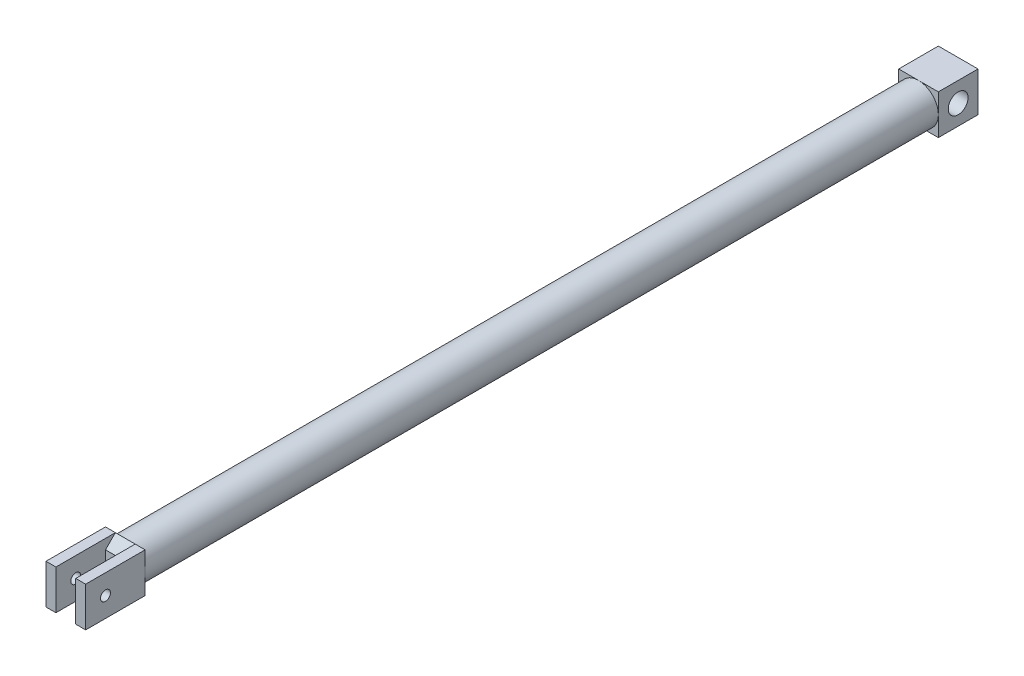
ISO-10303-21;
HEADER;
FILE_DESCRIPTION(('STEP AP214'),'2;1');
FILE_NAME('part.step','',(''),(''),'','','');
FILE_SCHEMA(('AUTOMOTIVE_DESIGN { 1 0 10303 214 1 1 1 1 }'));
ENDSEC;
DATA;
#1=APPLICATION_CONTEXT('core data for automotive mechanical design processes');
#2=APPLICATION_PROTOCOL_DEFINITION('international standard','automotive_design',2000,#1);
#3=PRODUCT_CONTEXT('',#1,'mechanical');
#4=PRODUCT('Part','Part','',(#3));
#5=PRODUCT_RELATED_PRODUCT_CATEGORY('part','',(#4));
#6=PRODUCT_DEFINITION_FORMATION('','',#4);
#7=PRODUCT_DEFINITION_CONTEXT('part definition',#1,'design');
#8=PRODUCT_DEFINITION('design','',#6,#7);
#9=PRODUCT_DEFINITION_SHAPE('','',#8);
#10=(LENGTH_UNIT() NAMED_UNIT(*) SI_UNIT(.MILLI.,.METRE.));
#11=(NAMED_UNIT(*) PLANE_ANGLE_UNIT() SI_UNIT($,.RADIAN.));
#12=(NAMED_UNIT(*) SI_UNIT($,.STERADIAN.) SOLID_ANGLE_UNIT());
#13=UNCERTAINTY_MEASURE_WITH_UNIT(LENGTH_MEASURE(1.E-05),#10,'distance_accuracy_value','');
#14=(GEOMETRIC_REPRESENTATION_CONTEXT(3) GLOBAL_UNCERTAINTY_ASSIGNED_CONTEXT((#13)) GLOBAL_UNIT_ASSIGNED_CONTEXT((#10,
#11,#12)) REPRESENTATION_CONTEXT('',''));
#15=CARTESIAN_POINT('',(0.,0.,0.));
#16=DIRECTION('',(0.,0.,1.));
#17=DIRECTION('',(1.,0.,0.));
#18=AXIS2_PLACEMENT_3D('',#15,#16,#17);
#19=CARTESIAN_POINT('',(-10.,10.,430.));
#20=DIRECTION('',(0.,-1.,0.));
#21=DIRECTION('',(0.,0.,-1.));
#22=AXIS2_PLACEMENT_3D('',#19,#20,#21);
#23=PLANE('',#22);
#24=DIRECTION('',(0.,0.,1.));
#25=VECTOR('',#24,1.);
#26=CARTESIAN_POINT('',(-5.,10.,405.));
#27=LINE('',#26,#25);
#28=CARTESIAN_POINT('',(-5.,10.,400.));
#29=VERTEX_POINT('',#28);
#30=CARTESIAN_POINT('',(-5.,10.,430.));
#31=VERTEX_POINT('',#30);
#32=EDGE_CURVE('E56',#29,#31,#27,.T.);
#33=ORIENTED_EDGE('',*,*,#32,.F.);
#34=DIRECTION('',(-1.,0.,0.));
#35=VECTOR('',#34,1.);
#36=CARTESIAN_POINT('',(-10.,10.,400.));
#37=LINE('',#36,#35);
#38=CARTESIAN_POINT('',(-10.,10.,400.));
#39=VERTEX_POINT('',#38);
#40=EDGE_CURVE('E209',#29,#39,#37,.T.);
#41=ORIENTED_EDGE('',*,*,#40,.T.);
#42=DIRECTION('',(0.,0.,-1.));
#43=VECTOR('',#42,1.);
#44=CARTESIAN_POINT('',(-10.,10.,430.));
#45=LINE('',#44,#43);
#46=CARTESIAN_POINT('',(-10.,10.,430.));
#47=VERTEX_POINT('',#46);
#48=EDGE_CURVE('E234',#47,#39,#45,.T.);
#49=ORIENTED_EDGE('',*,*,#48,.F.);
#50=DIRECTION('',(-1.,0.,0.));
#51=VECTOR('',#50,1.);
#52=CARTESIAN_POINT('',(-10.,10.,430.));
#53=LINE('',#52,#51);
#54=EDGE_CURVE('E192',#31,#47,#53,.T.);
#55=ORIENTED_EDGE('',*,*,#54,.F.);
#56=EDGE_LOOP('',(#33,#41,#49,#55));
#57=FACE_BOUND('',#56,.T.);
#58=ADVANCED_FACE('F39',(#57),#23,.F.);
#59=CARTESIAN_POINT('',(-10.,-10.,430.));
#60=DIRECTION('',(0.,1.,0.));
#61=DIRECTION('',(0.,0.,1.));
#62=AXIS2_PLACEMENT_3D('',#59,#60,#61);
#63=PLANE('',#62);
#64=DIRECTION('',(0.,0.,1.));
#65=VECTOR('',#64,1.);
#66=CARTESIAN_POINT('',(5.,-10.,405.));
#67=LINE('',#66,#65);
#68=CARTESIAN_POINT('',(5.,-10.,400.));
#69=VERTEX_POINT('',#68);
#70=CARTESIAN_POINT('',(5.,-10.,430.));
#71=VERTEX_POINT('',#70);
#72=EDGE_CURVE('E166',#69,#71,#67,.T.);
#73=ORIENTED_EDGE('',*,*,#72,.F.);
#74=DIRECTION('',(1.,0.,0.));
#75=VECTOR('',#74,1.);
#76=CARTESIAN_POINT('',(-10.,-10.,400.));
#77=LINE('',#76,#75);
#78=CARTESIAN_POINT('',(10.,-10.,400.));
#79=VERTEX_POINT('',#78);
#80=EDGE_CURVE('E220',#69,#79,#77,.T.);
#81=ORIENTED_EDGE('',*,*,#80,.T.);
#82=DIRECTION('',(0.,0.,-1.));
#83=VECTOR('',#82,1.);
#84=CARTESIAN_POINT('',(10.,-10.,430.));
#85=LINE('',#84,#83);
#86=CARTESIAN_POINT('',(10.,-10.,430.));
#87=VERTEX_POINT('',#86);
#88=EDGE_CURVE('E204',#87,#79,#85,.T.);
#89=ORIENTED_EDGE('',*,*,#88,.F.);
#90=DIRECTION('',(1.,0.,0.));
#91=VECTOR('',#90,1.);
#92=CARTESIAN_POINT('',(-10.,-10.,430.));
#93=LINE('',#92,#91);
#94=EDGE_CURVE('E196',#71,#87,#93,.T.);
#95=ORIENTED_EDGE('',*,*,#94,.F.);
#96=EDGE_LOOP('',(#73,#81,#89,#95));
#97=FACE_BOUND('',#96,.T.);
#98=ADVANCED_FACE('F420',(#97),#63,.F.);
#99=CARTESIAN_POINT('',(0.,0.,430.));
#100=DIRECTION('',(0.,0.,1.));
#101=DIRECTION('',(1.,0.,0.));
#102=AXIS2_PLACEMENT_3D('',#99,#100,#101);
#103=PLANE('',#102);
#104=DIRECTION('',(0.,1.,0.));
#105=VECTOR('',#104,1.);
#106=CARTESIAN_POINT('',(5.,10.,430.));
#107=LINE('',#106,#105);
#108=CARTESIAN_POINT('',(5.,10.,430.));
#109=VERTEX_POINT('',#108);
#110=EDGE_CURVE('E163',#71,#109,#107,.T.);
#111=ORIENTED_EDGE('',*,*,#110,.F.);
#112=ORIENTED_EDGE('',*,*,#94,.T.);
#113=DIRECTION('',(0.,1.,0.));
#114=VECTOR('',#113,1.);
#115=CARTESIAN_POINT('',(10.,10.,430.));
#116=LINE('',#115,#114);
#117=CARTESIAN_POINT('',(10.,10.,430.));
#118=VERTEX_POINT('',#117);
#119=EDGE_CURVE('E188',#87,#118,#116,.T.);
#120=ORIENTED_EDGE('',*,*,#119,.T.);
#121=EDGE_CURVE('E178',#118,#109,#53,.T.);
#122=ORIENTED_EDGE('',*,*,#121,.T.);
#123=EDGE_LOOP('',(#111,#112,#120,#122));
#124=FACE_BOUND('',#123,.T.);
#125=ADVANCED_FACE('F186',(#124),#103,.T.);
#126=CARTESIAN_POINT('',(0.,0.,400.));
#127=DIRECTION('',(0.,0.,-1.));
#128=DIRECTION('',(-1.,0.,0.));
#129=AXIS2_PLACEMENT_3D('',#126,#127,#128);
#130=CYLINDRICAL_SURFACE('',#129,10.);
#131=CARTESIAN_POINT('',(0.,0.,400.));
#132=DIRECTION('',(0.,0.,1.));
#133=DIRECTION('',(1.,0.,0.));
#134=AXIS2_PLACEMENT_3D('',#131,#132,#133);
#135=CIRCLE('',#134,10.);
#136=CARTESIAN_POINT('',(10.,0.,400.));
#137=VERTEX_POINT('',#136);
#138=CARTESIAN_POINT('',(0.,9.99999999999999,400.));
#139=VERTEX_POINT('',#138);
#140=EDGE_CURVE('E298',#137,#139,#135,.T.);
#141=ORIENTED_EDGE('',*,*,#140,.F.);
#142=CARTESIAN_POINT('',(0.,-9.99999999999999,400.));
#143=VERTEX_POINT('',#142);
#144=EDGE_CURVE('E304',#143,#137,#135,.T.);
#145=ORIENTED_EDGE('',*,*,#144,.F.);
#146=CARTESIAN_POINT('',(-10.,0.,400.));
#147=VERTEX_POINT('',#146);
#148=EDGE_CURVE('E361',#147,#143,#135,.T.);
#149=ORIENTED_EDGE('',*,*,#148,.F.);
#150=EDGE_CURVE('E303',#139,#147,#135,.T.);
#151=ORIENTED_EDGE('',*,*,#150,.F.);
#152=EDGE_LOOP('',(#141,#145,#149,#151));
#153=FACE_BOUND('',#152,.T.);
#154=CARTESIAN_POINT('',(0.,0.,0.));
#155=DIRECTION('',(0.,0.,1.));
#156=DIRECTION('',(1.,0.,0.));
#157=AXIS2_PLACEMENT_3D('',#154,#155,#156);
#158=CIRCLE('',#157,10.);
#159=CARTESIAN_POINT('',(10.,0.,0.));
#160=VERTEX_POINT('',#159);
#161=CARTESIAN_POINT('',(0.,10.,0.));
#162=VERTEX_POINT('',#161);
#163=EDGE_CURVE('E305',#160,#162,#158,.T.);
#164=ORIENTED_EDGE('',*,*,#163,.T.);
#165=CARTESIAN_POINT('',(-10.,0.,0.));
#166=VERTEX_POINT('',#165);
#167=EDGE_CURVE('E309',#162,#166,#158,.T.);
#168=ORIENTED_EDGE('',*,*,#167,.T.);
#169=CARTESIAN_POINT('',(0.,-10.,0.));
#170=VERTEX_POINT('',#169);
#171=EDGE_CURVE('E508',#166,#170,#158,.T.);
#172=ORIENTED_EDGE('',*,*,#171,.T.);
#173=EDGE_CURVE('E297',#170,#160,#158,.T.);
#174=ORIENTED_EDGE('',*,*,#173,.T.);
#175=EDGE_LOOP('',(#164,#168,#172,#174));
#176=FACE_BOUND('',#175,.T.);
#177=ADVANCED_FACE('F464',(#153,#176),#130,.T.);
#178=CARTESIAN_POINT('',(0.,0.,0.));
#179=DIRECTION('',(0.,0.,-1.));
#180=DIRECTION('',(-1.,0.,0.));
#181=AXIS2_PLACEMENT_3D('',#178,#179,#180);
#182=PLANE('',#181);
#183=ORIENTED_EDGE('',*,*,#163,.F.);
#184=DIRECTION('',(0.,-1.,0.));
#185=VECTOR('',#184,1.);
#186=CARTESIAN_POINT('',(10.,10.,0.));
#187=LINE('',#186,#185);
#188=CARTESIAN_POINT('',(10.,10.,0.));
#189=VERTEX_POINT('',#188);
#190=EDGE_CURVE('E275',#189,#160,#187,.T.);
#191=ORIENTED_EDGE('',*,*,#190,.F.);
#192=DIRECTION('',(1.,0.,0.));
#193=VECTOR('',#192,1.);
#194=CARTESIAN_POINT('',(10.,10.,0.));
#195=LINE('',#194,#193);
#196=EDGE_CURVE('E269',#162,#189,#195,.T.);
#197=ORIENTED_EDGE('',*,*,#196,.F.);
#198=EDGE_LOOP('',(#183,#191,#197));
#199=FACE_BOUND('',#198,.T.);
#200=ADVANCED_FACE('F447',(#199),#182,.F.);
#201=ORIENTED_EDGE('',*,*,#167,.F.);
#202=CARTESIAN_POINT('',(-9.99999999999999,10.,0.));
#203=VERTEX_POINT('',#202);
#204=EDGE_CURVE('E270',#203,#162,#195,.T.);
#205=ORIENTED_EDGE('',*,*,#204,.F.);
#206=DIRECTION('',(0.,1.,0.));
#207=VECTOR('',#206,1.);
#208=CARTESIAN_POINT('',(-9.99999999999999,10.,0.));
#209=LINE('',#208,#207);
#210=EDGE_CURVE('E249',#166,#203,#209,.T.);
#211=ORIENTED_EDGE('',*,*,#210,.F.);
#212=EDGE_LOOP('',(#201,#205,#211));
#213=FACE_BOUND('',#212,.T.);
#214=ADVANCED_FACE('F524',(#213),#182,.F.);
#215=ORIENTED_EDGE('',*,*,#171,.F.);
#216=CARTESIAN_POINT('',(-10.,-10.,0.));
#217=VERTEX_POINT('',#216);
#218=EDGE_CURVE('E265',#217,#166,#209,.T.);
#219=ORIENTED_EDGE('',*,*,#218,.F.);
#220=DIRECTION('',(-1.,0.,0.));
#221=VECTOR('',#220,1.);
#222=CARTESIAN_POINT('',(10.,-10.,0.));
#223=LINE('',#222,#221);
#224=EDGE_CURVE('E278',#170,#217,#223,.T.);
#225=ORIENTED_EDGE('',*,*,#224,.F.);
#226=EDGE_LOOP('',(#215,#219,#225));
#227=FACE_BOUND('',#226,.T.);
#228=ADVANCED_FACE('F448',(#227),#182,.F.);
#229=CARTESIAN_POINT('',(-9.99999999999999,10.,-20.));
#230=DIRECTION('',(1.,0.,0.));
#231=DIRECTION('',(0.,1.,0.));
#232=AXIS2_PLACEMENT_3D('',#229,#230,#231);
#233=PLANE('',#232);
#234=CARTESIAN_POINT('',(-10.,0.,-10.));
#235=DIRECTION('',(1.,0.,0.));
#236=DIRECTION('',(0.,1.,0.));
#237=AXIS2_PLACEMENT_3D('',#234,#235,#236);
#238=CIRCLE('',#237,5.);
#239=CARTESIAN_POINT('',(-10.,5.,-10.));
#240=VERTEX_POINT('',#239);
#241=EDGE_CURVE('E245',#240,#240,#238,.T.);
#242=ORIENTED_EDGE('',*,*,#241,.T.);
#243=EDGE_LOOP('',(#242));
#244=FACE_BOUND('',#243,.T.);
#245=ORIENTED_EDGE('',*,*,#218,.T.);
#246=ORIENTED_EDGE('',*,*,#210,.T.);
#247=DIRECTION('',(0.,0.,1.));
#248=VECTOR('',#247,1.);
#249=CARTESIAN_POINT('',(-9.99999999999999,10.,-20.));
#250=LINE('',#249,#248);
#251=CARTESIAN_POINT('',(-9.99999999999999,10.,-20.));
#252=VERTEX_POINT('',#251);
#253=EDGE_CURVE('E293',#252,#203,#250,.T.);
#254=ORIENTED_EDGE('',*,*,#253,.F.);
#255=DIRECTION('',(0.,1.,0.));
#256=VECTOR('',#255,1.);
#257=CARTESIAN_POINT('',(-9.99999999999999,10.,-20.));
#258=LINE('',#257,#256);
#259=CARTESIAN_POINT('',(-10.,-10.,-20.));
#260=VERTEX_POINT('',#259);
#261=EDGE_CURVE('E250',#260,#252,#258,.T.);
#262=ORIENTED_EDGE('',*,*,#261,.F.);
#263=DIRECTION('',(0.,0.,1.));
#264=VECTOR('',#263,1.);
#265=CARTESIAN_POINT('',(-10.,-10.,-20.));
#266=LINE('',#265,#264);
#267=EDGE_CURVE('E264',#260,#217,#266,.T.);
#268=ORIENTED_EDGE('',*,*,#267,.T.);
#269=EDGE_LOOP('',(#245,#246,#254,#262,#268));
#270=FACE_BOUND('',#269,.T.);
#271=ADVANCED_FACE('F459',(#244,#270),#233,.F.);
#272=CARTESIAN_POINT('',(10.,10.,-20.));
#273=DIRECTION('',(0.,-1.,0.));
#274=DIRECTION('',(0.,0.,-1.));
#275=AXIS2_PLACEMENT_3D('',#272,#273,#274);
#276=PLANE('',#275);
#277=ORIENTED_EDGE('',*,*,#204,.T.);
#278=ORIENTED_EDGE('',*,*,#196,.T.);
#279=DIRECTION('',(0.,0.,1.));
#280=VECTOR('',#279,1.);
#281=CARTESIAN_POINT('',(10.,10.,-20.));
#282=LINE('',#281,#280);
#283=CARTESIAN_POINT('',(10.,10.,-20.));
#284=VERTEX_POINT('',#283);
#285=EDGE_CURVE('E289',#284,#189,#282,.T.);
#286=ORIENTED_EDGE('',*,*,#285,.F.);
#287=DIRECTION('',(1.,0.,0.));
#288=VECTOR('',#287,1.);
#289=CARTESIAN_POINT('',(10.,10.,-20.));
#290=LINE('',#289,#288);
#291=EDGE_CURVE('E254',#252,#284,#290,.T.);
#292=ORIENTED_EDGE('',*,*,#291,.F.);
#293=ORIENTED_EDGE('',*,*,#253,.T.);
#294=EDGE_LOOP('',(#277,#278,#286,#292,#293));
#295=FACE_BOUND('',#294,.T.);
#296=ADVANCED_FACE('F455',(#295),#276,.F.);
#297=CARTESIAN_POINT('',(10.,10.,-20.));
#298=DIRECTION('',(-1.,0.,0.));
#299=DIRECTION('',(0.,-1.,0.));
#300=AXIS2_PLACEMENT_3D('',#297,#298,#299);
#301=PLANE('',#300);
#302=CARTESIAN_POINT('',(10.,0.,-10.));
#303=DIRECTION('',(1.,0.,0.));
#304=DIRECTION('',(0.,1.,0.));
#305=AXIS2_PLACEMENT_3D('',#302,#303,#304);
#306=CIRCLE('',#305,5.);
#307=CARTESIAN_POINT('',(10.,5.,-10.));
#308=VERTEX_POINT('',#307);
#309=EDGE_CURVE('E241',#308,#308,#306,.T.);
#310=ORIENTED_EDGE('',*,*,#309,.F.);
#311=EDGE_LOOP('',(#310));
#312=FACE_BOUND('',#311,.T.);
#313=ORIENTED_EDGE('',*,*,#190,.T.);
#314=CARTESIAN_POINT('',(10.,-10.,0.));
#315=VERTEX_POINT('',#314);
#316=EDGE_CURVE('E274',#160,#315,#187,.T.);
#317=ORIENTED_EDGE('',*,*,#316,.T.);
#318=DIRECTION('',(0.,0.,1.));
#319=VECTOR('',#318,1.);
#320=CARTESIAN_POINT('',(10.,-10.,-20.));
#321=LINE('',#320,#319);
#322=CARTESIAN_POINT('',(10.,-10.,-20.));
#323=VERTEX_POINT('',#322);
#324=EDGE_CURVE('E285',#323,#315,#321,.T.);
#325=ORIENTED_EDGE('',*,*,#324,.F.);
#326=DIRECTION('',(0.,-1.,0.));
#327=VECTOR('',#326,1.);
#328=CARTESIAN_POINT('',(10.,10.,-20.));
#329=LINE('',#328,#327);
#330=EDGE_CURVE('E258',#284,#323,#329,.T.);
#331=ORIENTED_EDGE('',*,*,#330,.F.);
#332=ORIENTED_EDGE('',*,*,#285,.T.);
#333=EDGE_LOOP('',(#313,#317,#325,#331,#332));
#334=FACE_BOUND('',#333,.T.);
#335=ADVANCED_FACE('F451',(#312,#334),#301,.F.);
#336=CARTESIAN_POINT('',(10.,-10.,-20.));
#337=DIRECTION('',(0.,1.,0.));
#338=DIRECTION('',(0.,0.,1.));
#339=AXIS2_PLACEMENT_3D('',#336,#337,#338);
#340=PLANE('',#339);
#341=EDGE_CURVE('E255',#315,#170,#223,.T.);
#342=ORIENTED_EDGE('',*,*,#341,.T.);
#343=ORIENTED_EDGE('',*,*,#224,.T.);
#344=ORIENTED_EDGE('',*,*,#267,.F.);
#345=DIRECTION('',(-1.,0.,0.));
#346=VECTOR('',#345,1.);
#347=CARTESIAN_POINT('',(10.,-10.,-20.));
#348=LINE('',#347,#346);
#349=EDGE_CURVE('E261',#323,#260,#348,.T.);
#350=ORIENTED_EDGE('',*,*,#349,.F.);
#351=ORIENTED_EDGE('',*,*,#324,.T.);
#352=EDGE_LOOP('',(#342,#343,#344,#350,#351));
#353=FACE_BOUND('',#352,.T.);
#354=ADVANCED_FACE('F442',(#353),#340,.F.);
#355=CARTESIAN_POINT('',(0.,0.,-20.));
#356=DIRECTION('',(0.,0.,-1.));
#357=DIRECTION('',(-1.,0.,0.));
#358=AXIS2_PLACEMENT_3D('',#355,#356,#357);
#359=PLANE('',#358);
#360=ORIENTED_EDGE('',*,*,#261,.T.);
#361=ORIENTED_EDGE('',*,*,#291,.T.);
#362=ORIENTED_EDGE('',*,*,#330,.T.);
#363=ORIENTED_EDGE('',*,*,#349,.T.);
#364=EDGE_LOOP('',(#360,#361,#362,#363));
#365=FACE_BOUND('',#364,.T.);
#366=ADVANCED_FACE('F439',(#365),#359,.T.);
#367=ORIENTED_EDGE('',*,*,#173,.F.);
#368=ORIENTED_EDGE('',*,*,#341,.F.);
#369=ORIENTED_EDGE('',*,*,#316,.F.);
#370=EDGE_LOOP('',(#367,#368,#369));
#371=FACE_BOUND('',#370,.T.);
#372=ADVANCED_FACE('F437',(#371),#182,.F.);
#373=CARTESIAN_POINT('',(-20.,0.,-10.));
#374=DIRECTION('',(1.,0.,0.));
#375=DIRECTION('',(0.,1.,0.));
#376=AXIS2_PLACEMENT_3D('',#373,#374,#375);
#377=CYLINDRICAL_SURFACE('',#376,5.);
#378=ORIENTED_EDGE('',*,*,#309,.T.);
#379=EDGE_LOOP('',(#378));
#380=FACE_BOUND('',#379,.T.);
#381=ORIENTED_EDGE('',*,*,#241,.F.);
#382=EDGE_LOOP('',(#381));
#383=FACE_BOUND('',#382,.T.);
#384=ADVANCED_FACE('F433',(#380,#383),#377,.F.);
#385=CARTESIAN_POINT('',(0.,0.,400.));
#386=DIRECTION('',(0.,0.,1.));
#387=DIRECTION('',(1.,0.,0.));
#388=AXIS2_PLACEMENT_3D('',#385,#386,#387);
#389=PLANE('',#388);
#390=DIRECTION('',(0.,1.,0.));
#391=VECTOR('',#390,1.);
#392=CARTESIAN_POINT('',(10.,10.,400.));
#393=LINE('',#392,#391);
#394=CARTESIAN_POINT('',(10.,10.,400.));
#395=VERTEX_POINT('',#394);
#396=EDGE_CURVE('E210',#137,#395,#393,.T.);
#397=ORIENTED_EDGE('',*,*,#396,.F.);
#398=ORIENTED_EDGE('',*,*,#140,.T.);
#399=CARTESIAN_POINT('',(5.,10.,400.));
#400=VERTEX_POINT('',#399);
#401=EDGE_CURVE('E214',#400,#139,#37,.T.);
#402=ORIENTED_EDGE('',*,*,#401,.F.);
#403=EDGE_CURVE('E181',#395,#400,#37,.T.);
#404=ORIENTED_EDGE('',*,*,#403,.F.);
#405=EDGE_LOOP('',(#397,#398,#402,#404));
#406=FACE_BOUND('',#405,.T.);
#407=ADVANCED_FACE('F436',(#406),#389,.F.);
#408=EDGE_CURVE('E215',#139,#29,#37,.T.);
#409=ORIENTED_EDGE('',*,*,#408,.F.);
#410=ORIENTED_EDGE('',*,*,#150,.T.);
#411=DIRECTION('',(0.,-1.,0.));
#412=VECTOR('',#411,1.);
#413=CARTESIAN_POINT('',(-10.,10.,400.));
#414=LINE('',#413,#412);
#415=EDGE_CURVE('E216',#39,#147,#414,.T.);
#416=ORIENTED_EDGE('',*,*,#415,.F.);
#417=ORIENTED_EDGE('',*,*,#40,.F.);
#418=EDGE_LOOP('',(#409,#410,#416,#417));
#419=FACE_BOUND('',#418,.T.);
#420=ADVANCED_FACE('F336',(#419),#389,.F.);
#421=CARTESIAN_POINT('',(-10.,-10.,400.));
#422=VERTEX_POINT('',#421);
#423=EDGE_CURVE('E213',#147,#422,#414,.T.);
#424=ORIENTED_EDGE('',*,*,#423,.F.);
#425=ORIENTED_EDGE('',*,*,#148,.T.);
#426=CARTESIAN_POINT('',(-5.,-10.,400.));
#427=VERTEX_POINT('',#426);
#428=EDGE_CURVE('E225',#427,#143,#77,.T.);
#429=ORIENTED_EDGE('',*,*,#428,.F.);
#430=EDGE_CURVE('E221',#422,#427,#77,.T.);
#431=ORIENTED_EDGE('',*,*,#430,.F.);
#432=EDGE_LOOP('',(#424,#425,#429,#431));
#433=FACE_BOUND('',#432,.T.);
#434=ADVANCED_FACE('F360',(#433),#389,.F.);
#435=EDGE_CURVE('E226',#143,#69,#77,.T.);
#436=ORIENTED_EDGE('',*,*,#435,.F.);
#437=ORIENTED_EDGE('',*,*,#144,.T.);
#438=EDGE_CURVE('E205',#79,#137,#393,.T.);
#439=ORIENTED_EDGE('',*,*,#438,.F.);
#440=ORIENTED_EDGE('',*,*,#80,.F.);
#441=EDGE_LOOP('',(#436,#437,#439,#440));
#442=FACE_BOUND('',#441,.T.);
#443=ADVANCED_FACE('F431',(#442),#389,.F.);
#444=CARTESIAN_POINT('',(10.,10.,430.));
#445=DIRECTION('',(-1.,0.,0.));
#446=DIRECTION('',(0.,0.,1.));
#447=AXIS2_PLACEMENT_3D('',#444,#445,#446);
#448=PLANE('',#447);
#449=CARTESIAN_POINT('',(10.,0.,420.));
#450=DIRECTION('',(1.,0.,0.));
#451=DIRECTION('',(0.,0.,-1.));
#452=AXIS2_PLACEMENT_3D('',#449,#450,#451);
#453=CIRCLE('',#452,2.50000000000002);
#454=CARTESIAN_POINT('',(10.,0.,417.5));
#455=VERTEX_POINT('',#454);
#456=EDGE_CURVE('E396',#455,#455,#453,.T.);
#457=ORIENTED_EDGE('',*,*,#456,.F.);
#458=EDGE_LOOP('',(#457));
#459=FACE_BOUND('',#458,.T.);
#460=ORIENTED_EDGE('',*,*,#438,.T.);
#461=ORIENTED_EDGE('',*,*,#396,.T.);
#462=DIRECTION('',(0.,0.,-1.));
#463=VECTOR('',#462,1.);
#464=CARTESIAN_POINT('',(10.,10.,430.));
#465=LINE('',#464,#463);
#466=EDGE_CURVE('E238',#118,#395,#465,.T.);
#467=ORIENTED_EDGE('',*,*,#466,.F.);
#468=ORIENTED_EDGE('',*,*,#119,.F.);
#469=ORIENTED_EDGE('',*,*,#88,.T.);
#470=EDGE_LOOP('',(#460,#461,#467,#468,#469));
#471=FACE_BOUND('',#470,.T.);
#472=ADVANCED_FACE('F421',(#459,#471),#448,.F.);
#473=ORIENTED_EDGE('',*,*,#403,.T.);
#474=DIRECTION('',(0.,0.,1.));
#475=VECTOR('',#474,1.);
#476=CARTESIAN_POINT('',(5.,10.,405.));
#477=LINE('',#476,#475);
#478=EDGE_CURVE('E63',#400,#109,#477,.T.);
#479=ORIENTED_EDGE('',*,*,#478,.T.);
#480=ORIENTED_EDGE('',*,*,#121,.F.);
#481=ORIENTED_EDGE('',*,*,#466,.T.);
#482=EDGE_LOOP('',(#473,#479,#480,#481));
#483=FACE_BOUND('',#482,.T.);
#484=ADVANCED_FACE('F176',(#483),#23,.F.);
#485=CARTESIAN_POINT('',(-10.,10.,430.));
#486=DIRECTION('',(1.,0.,0.));
#487=DIRECTION('',(0.,0.,-1.));
#488=AXIS2_PLACEMENT_3D('',#485,#486,#487);
#489=PLANE('',#488);
#490=CARTESIAN_POINT('',(-10.,0.,420.));
#491=DIRECTION('',(1.,0.,0.));
#492=DIRECTION('',(0.,0.,-1.));
#493=AXIS2_PLACEMENT_3D('',#490,#491,#492);
#494=CIRCLE('',#493,2.50000000000002);
#495=CARTESIAN_POINT('',(-10.,0.,417.5));
#496=VERTEX_POINT('',#495);
#497=EDGE_CURVE('E172',#496,#496,#494,.T.);
#498=ORIENTED_EDGE('',*,*,#497,.T.);
#499=EDGE_LOOP('',(#498));
#500=FACE_BOUND('',#499,.T.);
#501=ORIENTED_EDGE('',*,*,#415,.T.);
#502=ORIENTED_EDGE('',*,*,#423,.T.);
#503=DIRECTION('',(0.,0.,-1.));
#504=VECTOR('',#503,1.);
#505=CARTESIAN_POINT('',(-10.,-10.,430.));
#506=LINE('',#505,#504);
#507=CARTESIAN_POINT('',(-10.,-10.,430.));
#508=VERTEX_POINT('',#507);
#509=EDGE_CURVE('E230',#508,#422,#506,.T.);
#510=ORIENTED_EDGE('',*,*,#509,.F.);
#511=DIRECTION('',(0.,-1.,0.));
#512=VECTOR('',#511,1.);
#513=CARTESIAN_POINT('',(-10.,10.,430.));
#514=LINE('',#513,#512);
#515=EDGE_CURVE('E191',#47,#508,#514,.T.);
#516=ORIENTED_EDGE('',*,*,#515,.F.);
#517=ORIENTED_EDGE('',*,*,#48,.T.);
#518=EDGE_LOOP('',(#501,#502,#510,#516,#517));
#519=FACE_BOUND('',#518,.T.);
#520=ADVANCED_FACE('F370',(#500,#519),#489,.F.);
#521=ORIENTED_EDGE('',*,*,#430,.T.);
#522=DIRECTION('',(0.,0.,1.));
#523=VECTOR('',#522,1.);
#524=CARTESIAN_POINT('',(-5.,-10.,405.));
#525=LINE('',#524,#523);
#526=CARTESIAN_POINT('',(-5.,-10.,430.));
#527=VERTEX_POINT('',#526);
#528=EDGE_CURVE('E366',#427,#527,#525,.T.);
#529=ORIENTED_EDGE('',*,*,#528,.T.);
#530=EDGE_CURVE('E200',#508,#527,#93,.T.);
#531=ORIENTED_EDGE('',*,*,#530,.F.);
#532=ORIENTED_EDGE('',*,*,#509,.T.);
#533=EDGE_LOOP('',(#521,#529,#531,#532));
#534=FACE_BOUND('',#533,.T.);
#535=ADVANCED_FACE('F364',(#534),#63,.F.);
#536=DIRECTION('',(0.,-1.,0.));
#537=VECTOR('',#536,1.);
#538=CARTESIAN_POINT('',(-5.,10.,430.));
#539=LINE('',#538,#537);
#540=EDGE_CURVE('E171',#31,#527,#539,.T.);
#541=ORIENTED_EDGE('',*,*,#540,.F.);
#542=ORIENTED_EDGE('',*,*,#54,.T.);
#543=ORIENTED_EDGE('',*,*,#515,.T.);
#544=ORIENTED_EDGE('',*,*,#530,.T.);
#545=EDGE_LOOP('',(#541,#542,#543,#544));
#546=FACE_BOUND('',#545,.T.);
#547=ADVANCED_FACE('F372',(#546),#103,.T.);
#548=CARTESIAN_POINT('',(5.,10.,405.));
#549=DIRECTION('',(1.,0.,0.));
#550=DIRECTION('',(0.,0.,-1.));
#551=AXIS2_PLACEMENT_3D('',#548,#549,#550);
#552=PLANE('',#551);
#553=CARTESIAN_POINT('',(5.,0.,420.));
#554=DIRECTION('',(1.,0.,0.));
#555=DIRECTION('',(0.,0.,-1.));
#556=AXIS2_PLACEMENT_3D('',#553,#554,#555);
#557=CIRCLE('',#556,2.50000000000002);
#558=CARTESIAN_POINT('',(5.,0.,417.5));
#559=VERTEX_POINT('',#558);
#560=EDGE_CURVE('E392',#559,#559,#557,.T.);
#561=ORIENTED_EDGE('',*,*,#560,.T.);
#562=EDGE_LOOP('',(#561));
#563=FACE_BOUND('',#562,.T.);
#564=ORIENTED_EDGE('',*,*,#110,.T.);
#565=ORIENTED_EDGE('',*,*,#478,.F.);
#566=DIRECTION('',(0.,-0.707106781186543,0.707106781186552));
#567=VECTOR('',#566,1.);
#568=CARTESIAN_POINT('',(5.,7.49999999999997,402.5));
#569=LINE('',#568,#567);
#570=CARTESIAN_POINT('',(5.,5.,405.));
#571=VERTEX_POINT('',#570);
#572=EDGE_CURVE('E11',#400,#571,#569,.T.);
#573=ORIENTED_EDGE('',*,*,#572,.T.);
#574=DIRECTION('',(0.,1.,0.));
#575=VECTOR('',#574,1.);
#576=CARTESIAN_POINT('',(5.,10.,405.));
#577=LINE('',#576,#575);
#578=CARTESIAN_POINT('',(5.,-5.,405.));
#579=VERTEX_POINT('',#578);
#580=EDGE_CURVE('E374',#579,#571,#577,.T.);
#581=ORIENTED_EDGE('',*,*,#580,.F.);
#582=DIRECTION('',(0.,-0.707106781186543,-0.707106781186552));
#583=VECTOR('',#582,1.);
#584=CARTESIAN_POINT('',(5.,2.49999999999991,412.5));
#585=LINE('',#584,#583);
#586=EDGE_CURVE('E317',#579,#69,#585,.T.);
#587=ORIENTED_EDGE('',*,*,#586,.T.);
#588=ORIENTED_EDGE('',*,*,#72,.T.);
#589=EDGE_LOOP('',(#564,#565,#573,#581,#587,#588));
#590=FACE_BOUND('',#589,.T.);
#591=ADVANCED_FACE('F164',(#563,#590),#552,.F.);
#592=CARTESIAN_POINT('',(-5.,10.,405.));
#593=DIRECTION('',(-1.,0.,0.));
#594=DIRECTION('',(0.,0.,1.));
#595=AXIS2_PLACEMENT_3D('',#592,#593,#594);
#596=PLANE('',#595);
#597=CARTESIAN_POINT('',(-5.,0.,420.));
#598=DIRECTION('',(-1.,0.,0.));
#599=DIRECTION('',(0.,0.,1.));
#600=AXIS2_PLACEMENT_3D('',#597,#598,#599);
#601=CIRCLE('',#600,2.50000000000002);
#602=CARTESIAN_POINT('',(-5.,0.,422.5));
#603=VERTEX_POINT('',#602);
#604=EDGE_CURVE('E43',#603,#603,#601,.T.);
#605=ORIENTED_EDGE('',*,*,#604,.T.);
#606=EDGE_LOOP('',(#605));
#607=FACE_BOUND('',#606,.T.);
#608=ORIENTED_EDGE('',*,*,#540,.T.);
#609=ORIENTED_EDGE('',*,*,#528,.F.);
#610=DIRECTION('',(0.,0.707106781186543,0.707106781186552));
#611=VECTOR('',#610,1.);
#612=CARTESIAN_POINT('',(-5.,2.49999999999991,412.5));
#613=LINE('',#612,#611);
#614=CARTESIAN_POINT('',(-5.,-5.,405.));
#615=VERTEX_POINT('',#614);
#616=EDGE_CURVE('E320',#427,#615,#613,.T.);
#617=ORIENTED_EDGE('',*,*,#616,.T.);
#618=DIRECTION('',(0.,-1.,0.));
#619=VECTOR('',#618,1.);
#620=CARTESIAN_POINT('',(-5.,10.,405.));
#621=LINE('',#620,#619);
#622=CARTESIAN_POINT('',(-5.,5.,405.));
#623=VERTEX_POINT('',#622);
#624=EDGE_CURVE('E184',#623,#615,#621,.T.);
#625=ORIENTED_EDGE('',*,*,#624,.F.);
#626=DIRECTION('',(0.,0.707106781186543,-0.707106781186552));
#627=VECTOR('',#626,1.);
#628=CARTESIAN_POINT('',(-5.,7.49999999999997,402.5));
#629=LINE('',#628,#627);
#630=EDGE_CURVE('E49',#623,#29,#629,.T.);
#631=ORIENTED_EDGE('',*,*,#630,.T.);
#632=ORIENTED_EDGE('',*,*,#32,.T.);
#633=EDGE_LOOP('',(#608,#609,#617,#625,#631,#632));
#634=FACE_BOUND('',#633,.T.);
#635=ADVANCED_FACE('F327',(#607,#634),#596,.F.);
#636=CARTESIAN_POINT('',(0.,0.,405.));
#637=DIRECTION('',(0.,0.,1.));
#638=DIRECTION('',(1.,0.,0.));
#639=AXIS2_PLACEMENT_3D('',#636,#637,#638);
#640=PLANE('',#639);
#641=ORIENTED_EDGE('',*,*,#624,.T.);
#642=DIRECTION('',(1.,0.,0.));
#643=VECTOR('',#642,1.);
#644=CARTESIAN_POINT('',(5.,-5.,405.));
#645=LINE('',#644,#643);
#646=EDGE_CURVE('E313',#615,#579,#645,.T.);
#647=ORIENTED_EDGE('',*,*,#646,.T.);
#648=ORIENTED_EDGE('',*,*,#580,.T.);
#649=DIRECTION('',(-1.,0.,0.));
#650=VECTOR('',#649,1.);
#651=CARTESIAN_POINT('',(-5.,5.,405.));
#652=LINE('',#651,#650);
#653=EDGE_CURVE('E302',#571,#623,#652,.T.);
#654=ORIENTED_EDGE('',*,*,#653,.T.);
#655=EDGE_LOOP('',(#641,#647,#648,#654));
#656=FACE_BOUND('',#655,.T.);
#657=ADVANCED_FACE('F468',(#656),#640,.T.);
#658=CARTESIAN_POINT('',(0.,-5.,405.));
#659=DIRECTION('',(0.,-0.707106781186552,0.707106781186543));
#660=DIRECTION('',(-1.,0.,0.));
#661=AXIS2_PLACEMENT_3D('',#658,#659,#660);
#662=PLANE('',#661);
#663=ORIENTED_EDGE('',*,*,#428,.T.);
#664=ORIENTED_EDGE('',*,*,#435,.T.);
#665=ORIENTED_EDGE('',*,*,#586,.F.);
#666=ORIENTED_EDGE('',*,*,#646,.F.);
#667=ORIENTED_EDGE('',*,*,#616,.F.);
#668=EDGE_LOOP('',(#663,#664,#665,#666,#667));
#669=FACE_BOUND('',#668,.T.);
#670=ADVANCED_FACE('F353',(#669),#662,.T.);
#671=CARTESIAN_POINT('',(0.,5.,405.));
#672=DIRECTION('',(0.,0.707106781186552,0.707106781186543));
#673=DIRECTION('',(1.,0.,0.));
#674=AXIS2_PLACEMENT_3D('',#671,#672,#673);
#675=PLANE('',#674);
#676=ORIENTED_EDGE('',*,*,#401,.T.);
#677=ORIENTED_EDGE('',*,*,#408,.T.);
#678=ORIENTED_EDGE('',*,*,#630,.F.);
#679=ORIENTED_EDGE('',*,*,#653,.F.);
#680=ORIENTED_EDGE('',*,*,#572,.F.);
#681=EDGE_LOOP('',(#676,#677,#678,#679,#680));
#682=FACE_BOUND('',#681,.T.);
#683=ADVANCED_FACE('F41',(#682),#675,.T.);
#684=CARTESIAN_POINT('',(-15.,0.,420.));
#685=DIRECTION('',(1.,0.,0.));
#686=DIRECTION('',(0.,0.,-1.));
#687=AXIS2_PLACEMENT_3D('',#684,#685,#686);
#688=CYLINDRICAL_SURFACE('',#687,2.50000000000002);
#689=ORIENTED_EDGE('',*,*,#604,.F.);
#690=EDGE_LOOP('',(#689));
#691=FACE_BOUND('',#690,.T.);
#692=ORIENTED_EDGE('',*,*,#497,.F.);
#693=EDGE_LOOP('',(#692));
#694=FACE_BOUND('',#693,.T.);
#695=ADVANCED_FACE('F406',(#691,#694),#688,.F.);
#696=ORIENTED_EDGE('',*,*,#456,.T.);
#697=EDGE_LOOP('',(#696));
#698=FACE_BOUND('',#697,.T.);
#699=ORIENTED_EDGE('',*,*,#560,.F.);
#700=EDGE_LOOP('',(#699));
#701=FACE_BOUND('',#700,.T.);
#702=ADVANCED_FACE('F409',(#698,#701),#688,.F.);
#703=CLOSED_SHELL('',(#58,#98,#125,#177,#200,#214,#228,#271,#296,#335,#354,#366,#372,#384,#407,
#420,#434,#443,#472,#484,#520,#535,#547,#591,#635,#657,#670,#683,#695,#702));
#704=MANIFOLD_SOLID_BREP('B2',#703);
#705=ADVANCED_BREP_SHAPE_REPRESENTATION('',(#18,#704),#14);
#706=SHAPE_DEFINITION_REPRESENTATION(#9,#705);
ENDSEC;
END-ISO-10303-21;
